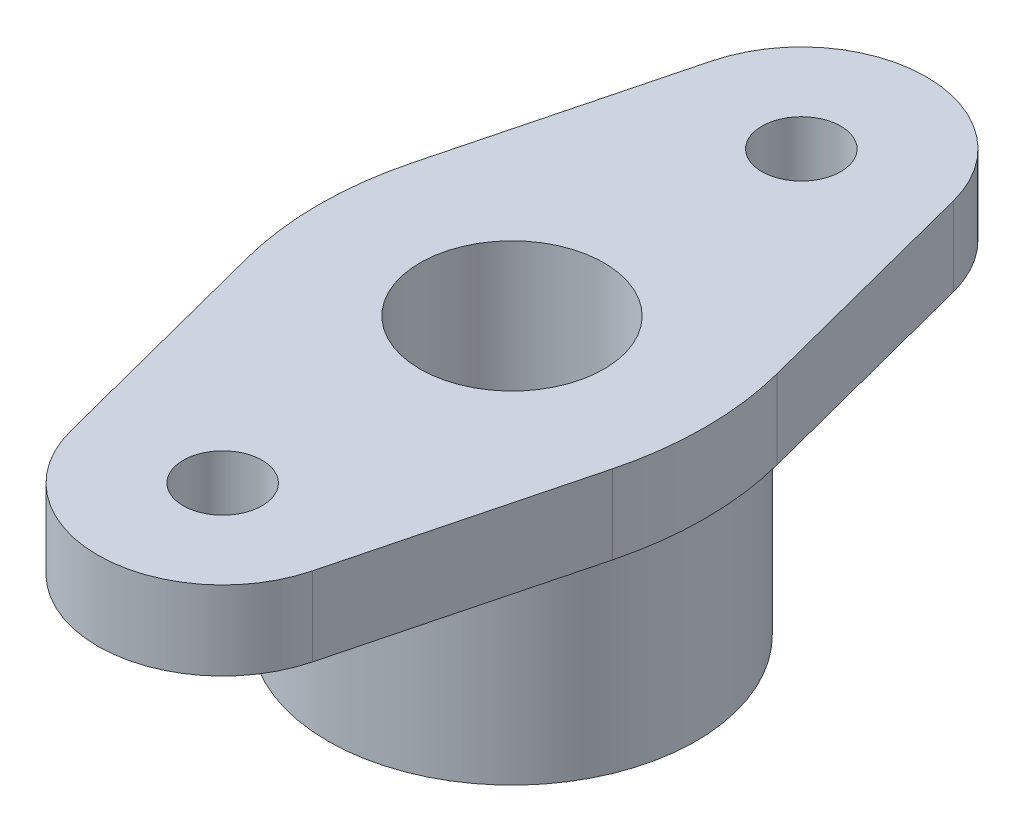
ISO-10303-21;
HEADER;
FILE_DESCRIPTION(('STEP AP214'),'2;1');
FILE_NAME('part.step','',(''),(''),'','','');
FILE_SCHEMA(('AUTOMOTIVE_DESIGN { 1 0 10303 214 1 1 1 1 }'));
ENDSEC;
DATA;
#1=APPLICATION_CONTEXT('core data for automotive mechanical design processes');
#2=APPLICATION_PROTOCOL_DEFINITION('international standard','automotive_design',2000,#1);
#3=PRODUCT_CONTEXT('',#1,'mechanical');
#4=PRODUCT('Part','Part','',(#3));
#5=PRODUCT_RELATED_PRODUCT_CATEGORY('part','',(#4));
#6=PRODUCT_DEFINITION_FORMATION('','',#4);
#7=PRODUCT_DEFINITION_CONTEXT('part definition',#1,'design');
#8=PRODUCT_DEFINITION('design','',#6,#7);
#9=PRODUCT_DEFINITION_SHAPE('','',#8);
#10=(LENGTH_UNIT() NAMED_UNIT(*) SI_UNIT(.MILLI.,.METRE.));
#11=(NAMED_UNIT(*) PLANE_ANGLE_UNIT() SI_UNIT($,.RADIAN.));
#12=(NAMED_UNIT(*) SI_UNIT($,.STERADIAN.) SOLID_ANGLE_UNIT());
#13=UNCERTAINTY_MEASURE_WITH_UNIT(LENGTH_MEASURE(1.E-05),#10,'distance_accuracy_value','');
#14=(GEOMETRIC_REPRESENTATION_CONTEXT(3) GLOBAL_UNCERTAINTY_ASSIGNED_CONTEXT((#13)) GLOBAL_UNIT_ASSIGNED_CONTEXT((#10,
#11,#12)) REPRESENTATION_CONTEXT('',''));
#15=CARTESIAN_POINT('',(0.,0.,0.));
#16=DIRECTION('',(0.,0.,1.));
#17=DIRECTION('',(1.,0.,0.));
#18=AXIS2_PLACEMENT_3D('',#15,#16,#17);
#19=CARTESIAN_POINT('',(0.,12.,44.));
#20=DIRECTION('',(0.,-1.,0.));
#21=DIRECTION('',(0.,0.,-1.));
#22=AXIS2_PLACEMENT_3D('',#19,#20,#21);
#23=CYLINDRICAL_SURFACE('',#22,19.);
#24=CARTESIAN_POINT('',(0.,0.,44.));
#25=DIRECTION('',(0.,1.,0.));
#26=DIRECTION('',(0.,0.,1.));
#27=AXIS2_PLACEMENT_3D('',#24,#25,#26);
#28=CIRCLE('',#27,19.);
#29=CARTESIAN_POINT('',(18.3951965051348,0.,48.7557066286177));
#30=VERTEX_POINT('',#29);
#31=CARTESIAN_POINT('',(-18.3951965051348,0.,48.7557066286177));
#32=VERTEX_POINT('',#31);
#33=EDGE_CURVE('E108',#30,#32,#28,.F.);
#34=ORIENTED_EDGE('',*,*,#33,.F.);
#35=DIRECTION('',(0.,-1.,0.));
#36=VECTOR('',#35,1.);
#37=CARTESIAN_POINT('',(18.3951965051348,12.,48.7557066286177));
#38=LINE('',#37,#36);
#39=CARTESIAN_POINT('',(18.3951965051348,12.,48.7557066286177));
#40=VERTEX_POINT('',#39);
#41=EDGE_CURVE('E103',#40,#30,#38,.T.);
#42=ORIENTED_EDGE('',*,*,#41,.F.);
#43=CARTESIAN_POINT('',(0.,12.,44.));
#44=DIRECTION('',(0.,1.,0.));
#45=DIRECTION('',(0.,0.,1.));
#46=AXIS2_PLACEMENT_3D('',#43,#44,#45);
#47=CIRCLE('',#46,19.);
#48=CARTESIAN_POINT('',(-18.3951965051348,12.,48.7557066286177));
#49=VERTEX_POINT('',#48);
#50=EDGE_CURVE('E105',#40,#49,#47,.F.);
#51=ORIENTED_EDGE('',*,*,#50,.T.);
#52=DIRECTION('',(0.,-1.,0.));
#53=VECTOR('',#52,1.);
#54=CARTESIAN_POINT('',(-18.3951965051348,12.,48.7557066286177));
#55=LINE('',#54,#53);
#56=EDGE_CURVE('E139',#49,#32,#55,.T.);
#57=ORIENTED_EDGE('',*,*,#56,.T.);
#58=EDGE_LOOP('',(#34,#42,#51,#57));
#59=FACE_BOUND('',#58,.T.);
#60=ADVANCED_FACE('F36',(#59),#23,.T.);
#61=CARTESIAN_POINT('',(29.0578417959506,12.,7.51231827307482));
#62=DIRECTION('',(-0.968168237112356,0.,-0.250300348874614));
#63=DIRECTION('',(-0.250300348874614,0.,0.968168237112356));
#64=AXIS2_PLACEMENT_3D('',#61,#62,#63);
#65=PLANE('',#64);
#66=DIRECTION('',(0.250300348874614,0.,-0.968168237112356));
#67=VECTOR('',#66,1.);
#68=CARTESIAN_POINT('',(29.0578417959506,0.,7.51231827307482));
#69=LINE('',#68,#67);
#70=CARTESIAN_POINT('',(27.7644949376973,0.,12.5150174437307));
#71=VERTEX_POINT('',#70);
#72=EDGE_CURVE('E145',#30,#71,#69,.T.);
#73=ORIENTED_EDGE('',*,*,#72,.T.);
#74=DIRECTION('',(0.,-1.,0.));
#75=VECTOR('',#74,1.);
#76=CARTESIAN_POINT('',(27.7644949376973,12.,12.5150174437307));
#77=LINE('',#76,#75);
#78=CARTESIAN_POINT('',(27.7644949376973,12.,12.5150174437307));
#79=VERTEX_POINT('',#78);
#80=EDGE_CURVE('E44',#71,#79,#77,.F.);
#81=ORIENTED_EDGE('',*,*,#80,.T.);
#82=DIRECTION('',(0.250300348874614,0.,-0.968168237112356));
#83=VECTOR('',#82,1.);
#84=CARTESIAN_POINT('',(29.0578417959506,12.,7.51231827307482));
#85=LINE('',#84,#83);
#86=EDGE_CURVE('E113',#40,#79,#85,.T.);
#87=ORIENTED_EDGE('',*,*,#86,.F.);
#88=ORIENTED_EDGE('',*,*,#41,.T.);
#89=EDGE_LOOP('',(#73,#81,#87,#88));
#90=FACE_BOUND('',#89,.T.);
#91=ADVANCED_FACE('F114',(#90),#65,.F.);
#92=CARTESIAN_POINT('',(29.0578417959506,12.,-7.51231827307482));
#93=DIRECTION('',(0.968168237112356,0.,-0.250300348874614));
#94=DIRECTION('',(-0.250300348874614,0.,-0.968168237112356));
#95=AXIS2_PLACEMENT_3D('',#92,#93,#94);
#96=PLANE('',#95);
#97=DIRECTION('',(0.250300348874614,0.,0.968168237112356));
#98=VECTOR('',#97,1.);
#99=CARTESIAN_POINT('',(29.0578417959506,12.,-7.51231827307482));
#100=LINE('',#99,#98);
#101=CARTESIAN_POINT('',(18.3951965051348,12.,-48.7557066286177));
#102=VERTEX_POINT('',#101);
#103=CARTESIAN_POINT('',(27.7644949376973,12.,-12.5150174437307));
#104=VERTEX_POINT('',#103);
#105=EDGE_CURVE('E115',#102,#104,#100,.T.);
#106=ORIENTED_EDGE('',*,*,#105,.T.);
#107=DIRECTION('',(0.,-1.,0.));
#108=VECTOR('',#107,1.);
#109=CARTESIAN_POINT('',(27.7644949376973,0.,-12.5150174437307));
#110=LINE('',#109,#108);
#111=CARTESIAN_POINT('',(27.7644949376973,0.,-12.5150174437307));
#112=VERTEX_POINT('',#111);
#113=EDGE_CURVE('E178',#104,#112,#110,.T.);
#114=ORIENTED_EDGE('',*,*,#113,.T.);
#115=DIRECTION('',(0.250300348874614,0.,0.968168237112356));
#116=VECTOR('',#115,1.);
#117=CARTESIAN_POINT('',(29.0578417959506,0.,-7.51231827307482));
#118=LINE('',#117,#116);
#119=CARTESIAN_POINT('',(18.3951965051348,0.,-48.7557066286177));
#120=VERTEX_POINT('',#119);
#121=EDGE_CURVE('E147',#120,#112,#118,.T.);
#122=ORIENTED_EDGE('',*,*,#121,.F.);
#123=DIRECTION('',(0.,-1.,0.));
#124=VECTOR('',#123,1.);
#125=CARTESIAN_POINT('',(18.3951965051348,12.,-48.7557066286177));
#126=LINE('',#125,#124);
#127=EDGE_CURVE('E111',#102,#120,#126,.T.);
#128=ORIENTED_EDGE('',*,*,#127,.F.);
#129=EDGE_LOOP('',(#106,#114,#122,#128));
#130=FACE_BOUND('',#129,.T.);
#131=ADVANCED_FACE('F183',(#130),#96,.T.);
#132=CARTESIAN_POINT('',(0.,12.,-44.));
#133=DIRECTION('',(0.,-1.,0.));
#134=DIRECTION('',(0.,0.,-1.));
#135=AXIS2_PLACEMENT_3D('',#132,#133,#134);
#136=CYLINDRICAL_SURFACE('',#135,19.);
#137=CARTESIAN_POINT('',(0.,0.,-44.));
#138=DIRECTION('',(0.,1.,0.));
#139=DIRECTION('',(0.,0.,1.));
#140=AXIS2_PLACEMENT_3D('',#137,#138,#139);
#141=CIRCLE('',#140,19.);
#142=CARTESIAN_POINT('',(-18.3951965051348,0.,-48.7557066286177));
#143=VERTEX_POINT('',#142);
#144=EDGE_CURVE('E150',#120,#143,#141,.T.);
#145=ORIENTED_EDGE('',*,*,#144,.T.);
#146=DIRECTION('',(0.,-1.,0.));
#147=VECTOR('',#146,1.);
#148=CARTESIAN_POINT('',(-18.3951965051348,12.,-48.7557066286177));
#149=LINE('',#148,#147);
#150=CARTESIAN_POINT('',(-18.3951965051348,12.,-48.7557066286177));
#151=VERTEX_POINT('',#150);
#152=EDGE_CURVE('E163',#151,#143,#149,.T.);
#153=ORIENTED_EDGE('',*,*,#152,.F.);
#154=CARTESIAN_POINT('',(0.,12.,-44.));
#155=DIRECTION('',(0.,1.,0.));
#156=DIRECTION('',(0.,0.,1.));
#157=AXIS2_PLACEMENT_3D('',#154,#155,#156);
#158=CIRCLE('',#157,19.);
#159=EDGE_CURVE('E130',#102,#151,#158,.T.);
#160=ORIENTED_EDGE('',*,*,#159,.F.);
#161=ORIENTED_EDGE('',*,*,#127,.T.);
#162=EDGE_LOOP('',(#145,#153,#160,#161));
#163=FACE_BOUND('',#162,.T.);
#164=ADVANCED_FACE('F191',(#163),#136,.T.);
#165=CARTESIAN_POINT('',(-29.0578417959506,12.,-7.51231827307482));
#166=DIRECTION('',(0.968168237112356,0.,0.250300348874614));
#167=DIRECTION('',(0.250300348874614,0.,-0.968168237112356));
#168=AXIS2_PLACEMENT_3D('',#165,#166,#167);
#169=PLANE('',#168);
#170=DIRECTION('',(-0.250300348874614,0.,0.968168237112356));
#171=VECTOR('',#170,1.);
#172=CARTESIAN_POINT('',(-29.0578417959506,0.,-7.51231827307482));
#173=LINE('',#172,#171);
#174=CARTESIAN_POINT('',(-27.7644949376973,0.,-12.5150174437307));
#175=VERTEX_POINT('',#174);
#176=EDGE_CURVE('E153',#143,#175,#173,.T.);
#177=ORIENTED_EDGE('',*,*,#176,.T.);
#178=DIRECTION('',(0.,-1.,0.));
#179=VECTOR('',#178,1.);
#180=CARTESIAN_POINT('',(-27.7644949376973,12.,-12.5150174437307));
#181=LINE('',#180,#179);
#182=CARTESIAN_POINT('',(-27.7644949376973,12.,-12.5150174437307));
#183=VERTEX_POINT('',#182);
#184=EDGE_CURVE('E173',#175,#183,#181,.F.);
#185=ORIENTED_EDGE('',*,*,#184,.T.);
#186=DIRECTION('',(-0.250300348874614,0.,0.968168237112356));
#187=VECTOR('',#186,1.);
#188=CARTESIAN_POINT('',(-29.0578417959506,12.,-7.51231827307482));
#189=LINE('',#188,#187);
#190=EDGE_CURVE('E133',#151,#183,#189,.T.);
#191=ORIENTED_EDGE('',*,*,#190,.F.);
#192=ORIENTED_EDGE('',*,*,#152,.T.);
#193=EDGE_LOOP('',(#177,#185,#191,#192));
#194=FACE_BOUND('',#193,.T.);
#195=ADVANCED_FACE('F258',(#194),#169,.F.);
#196=CARTESIAN_POINT('',(-29.0578417959506,12.,7.51231827307483));
#197=DIRECTION('',(-0.968168237112356,0.,0.250300348874614));
#198=DIRECTION('',(0.250300348874614,0.,0.968168237112356));
#199=AXIS2_PLACEMENT_3D('',#196,#197,#198);
#200=PLANE('',#199);
#201=DIRECTION('',(-0.250300348874614,0.,-0.968168237112356));
#202=VECTOR('',#201,1.);
#203=CARTESIAN_POINT('',(-29.0578417959506,12.,7.51231827307483));
#204=LINE('',#203,#202);
#205=CARTESIAN_POINT('',(-27.7644949376973,12.,12.5150174437307));
#206=VERTEX_POINT('',#205);
#207=EDGE_CURVE('E121',#49,#206,#204,.T.);
#208=ORIENTED_EDGE('',*,*,#207,.T.);
#209=DIRECTION('',(0.,-1.,0.));
#210=VECTOR('',#209,1.);
#211=CARTESIAN_POINT('',(-27.7644949376973,0.,12.5150174437307));
#212=LINE('',#211,#210);
#213=CARTESIAN_POINT('',(-27.7644949376973,0.,12.5150174437307));
#214=VERTEX_POINT('',#213);
#215=EDGE_CURVE('E110',#206,#214,#212,.T.);
#216=ORIENTED_EDGE('',*,*,#215,.T.);
#217=DIRECTION('',(-0.250300348874614,0.,-0.968168237112356));
#218=VECTOR('',#217,1.);
#219=CARTESIAN_POINT('',(-29.0578417959506,0.,7.51231827307483));
#220=LINE('',#219,#218);
#221=EDGE_CURVE('E156',#32,#214,#220,.T.);
#222=ORIENTED_EDGE('',*,*,#221,.F.);
#223=ORIENTED_EDGE('',*,*,#56,.F.);
#224=EDGE_LOOP('',(#208,#216,#222,#223));
#225=FACE_BOUND('',#224,.T.);
#226=ADVANCED_FACE('F201',(#225),#200,.T.);
#227=CARTESIAN_POINT('',(0.,12.,-44.));
#228=DIRECTION('',(0.,-1.,0.));
#229=DIRECTION('',(0.,0.,-1.));
#230=AXIS2_PLACEMENT_3D('',#227,#228,#229);
#231=CYLINDRICAL_SURFACE('',#230,6.);
#232=CARTESIAN_POINT('',(0.,12.,-44.));
#233=DIRECTION('',(0.,1.,0.));
#234=DIRECTION('',(0.,0.,1.));
#235=AXIS2_PLACEMENT_3D('',#232,#233,#234);
#236=CIRCLE('',#235,6.);
#237=CARTESIAN_POINT('',(0.,12.,-38.));
#238=VERTEX_POINT('',#237);
#239=EDGE_CURVE('E122',#238,#238,#236,.T.);
#240=ORIENTED_EDGE('',*,*,#239,.T.);
#241=EDGE_LOOP('',(#240));
#242=FACE_BOUND('',#241,.T.);
#243=CARTESIAN_POINT('',(0.,0.,-44.));
#244=DIRECTION('',(0.,1.,0.));
#245=DIRECTION('',(0.,0.,1.));
#246=AXIS2_PLACEMENT_3D('',#243,#244,#245);
#247=CIRCLE('',#246,6.);
#248=CARTESIAN_POINT('',(0.,0.,-38.));
#249=VERTEX_POINT('',#248);
#250=EDGE_CURVE('E140',#249,#249,#247,.T.);
#251=ORIENTED_EDGE('',*,*,#250,.F.);
#252=EDGE_LOOP('',(#251));
#253=FACE_BOUND('',#252,.T.);
#254=ADVANCED_FACE('F219',(#242,#253),#231,.F.);
#255=CARTESIAN_POINT('',(0.,12.,0.));
#256=DIRECTION('',(0.,-1.,0.));
#257=DIRECTION('',(0.,0.,-1.));
#258=AXIS2_PLACEMENT_3D('',#255,#256,#257);
#259=CYLINDRICAL_SURFACE('',#258,14.);
#260=CARTESIAN_POINT('',(0.,12.,0.));
#261=DIRECTION('',(0.,1.,0.));
#262=DIRECTION('',(0.,0.,1.));
#263=AXIS2_PLACEMENT_3D('',#260,#261,#262);
#264=CIRCLE('',#263,14.);
#265=CARTESIAN_POINT('',(0.,12.,14.));
#266=VERTEX_POINT('',#265);
#267=EDGE_CURVE('E125',#266,#266,#264,.T.);
#268=ORIENTED_EDGE('',*,*,#267,.T.);
#269=EDGE_LOOP('',(#268));
#270=FACE_BOUND('',#269,.T.);
#271=CARTESIAN_POINT('',(0.,-21.9170962313451,0.));
#272=DIRECTION('',(0.,1.,0.));
#273=DIRECTION('',(0.,0.,1.));
#274=AXIS2_PLACEMENT_3D('',#271,#272,#273);
#275=CIRCLE('',#274,14.);
#276=CARTESIAN_POINT('',(0.,-21.9170962313451,14.));
#277=VERTEX_POINT('',#276);
#278=EDGE_CURVE('E237',#277,#277,#275,.T.);
#279=ORIENTED_EDGE('',*,*,#278,.F.);
#280=EDGE_LOOP('',(#279));
#281=FACE_BOUND('',#280,.T.);
#282=ADVANCED_FACE('F222',(#270,#281),#259,.F.);
#283=CARTESIAN_POINT('',(0.,12.,44.));
#284=DIRECTION('',(0.,-1.,0.));
#285=DIRECTION('',(0.,0.,-1.));
#286=AXIS2_PLACEMENT_3D('',#283,#284,#285);
#287=CYLINDRICAL_SURFACE('',#286,6.);
#288=CARTESIAN_POINT('',(0.,12.,44.));
#289=DIRECTION('',(0.,1.,0.));
#290=DIRECTION('',(0.,0.,1.));
#291=AXIS2_PLACEMENT_3D('',#288,#289,#290);
#292=CIRCLE('',#291,6.);
#293=CARTESIAN_POINT('',(0.,12.,50.));
#294=VERTEX_POINT('',#293);
#295=EDGE_CURVE('E136',#294,#294,#292,.F.);
#296=ORIENTED_EDGE('',*,*,#295,.F.);
#297=EDGE_LOOP('',(#296));
#298=FACE_BOUND('',#297,.T.);
#299=CARTESIAN_POINT('',(0.,0.,44.));
#300=DIRECTION('',(0.,1.,0.));
#301=DIRECTION('',(0.,0.,1.));
#302=AXIS2_PLACEMENT_3D('',#299,#300,#301);
#303=CIRCLE('',#302,6.);
#304=CARTESIAN_POINT('',(0.,0.,50.));
#305=VERTEX_POINT('',#304);
#306=EDGE_CURVE('E159',#305,#305,#303,.F.);
#307=ORIENTED_EDGE('',*,*,#306,.T.);
#308=EDGE_LOOP('',(#307));
#309=FACE_BOUND('',#308,.T.);
#310=ADVANCED_FACE('F225',(#298,#309),#287,.F.);
#311=CARTESIAN_POINT('',(0.,12.,0.));
#312=DIRECTION('',(0.,1.,0.));
#313=DIRECTION('',(0.,0.,1.));
#314=AXIS2_PLACEMENT_3D('',#311,#312,#313);
#315=PLANE('',#314);
#316=ORIENTED_EDGE('',*,*,#267,.F.);
#317=EDGE_LOOP('',(#316));
#318=FACE_BOUND('',#317,.T.);
#319=ORIENTED_EDGE('',*,*,#239,.F.);
#320=EDGE_LOOP('',(#319));
#321=FACE_BOUND('',#320,.T.);
#322=ORIENTED_EDGE('',*,*,#190,.T.);
#323=CARTESIAN_POINT('',(20.6439169179205,12.,0.));
#324=DIRECTION('',(0.,1.,0.));
#325=DIRECTION('',(0.,0.,1.));
#326=AXIS2_PLACEMENT_3D('',#323,#324,#325);
#327=CIRCLE('',#326,50.);
#328=EDGE_CURVE('E176',#183,#206,#327,.T.);
#329=ORIENTED_EDGE('',*,*,#328,.T.);
#330=ORIENTED_EDGE('',*,*,#207,.F.);
#331=ORIENTED_EDGE('',*,*,#50,.F.);
#332=ORIENTED_EDGE('',*,*,#86,.T.);
#333=CARTESIAN_POINT('',(-20.6439169179205,12.,0.));
#334=DIRECTION('',(0.,1.,0.));
#335=DIRECTION('',(0.,0.,1.));
#336=AXIS2_PLACEMENT_3D('',#333,#334,#335);
#337=CIRCLE('',#336,50.);
#338=EDGE_CURVE('E51',#79,#104,#337,.T.);
#339=ORIENTED_EDGE('',*,*,#338,.T.);
#340=ORIENTED_EDGE('',*,*,#105,.F.);
#341=ORIENTED_EDGE('',*,*,#159,.T.);
#342=EDGE_LOOP('',(#322,#329,#330,#331,#332,#339,#340,#341));
#343=FACE_BOUND('',#342,.T.);
#344=ORIENTED_EDGE('',*,*,#295,.T.);
#345=EDGE_LOOP('',(#344));
#346=FACE_BOUND('',#345,.T.);
#347=ADVANCED_FACE('F118',(#318,#321,#343,#346),#315,.T.);
#348=CARTESIAN_POINT('',(0.,0.,0.));
#349=DIRECTION('',(0.,1.,0.));
#350=DIRECTION('',(0.,0.,1.));
#351=AXIS2_PLACEMENT_3D('',#348,#349,#350);
#352=PLANE('',#351);
#353=CARTESIAN_POINT('',(0.,0.,0.));
#354=DIRECTION('',(0.,1.,0.));
#355=DIRECTION('',(0.,0.,1.));
#356=AXIS2_PLACEMENT_3D('',#353,#354,#355);
#357=CIRCLE('',#356,28.);
#358=CARTESIAN_POINT('',(0.,0.,28.));
#359=VERTEX_POINT('',#358);
#360=EDGE_CURVE('E11',#359,#359,#357,.F.);
#361=ORIENTED_EDGE('',*,*,#360,.F.);
#362=EDGE_LOOP('',(#361));
#363=FACE_BOUND('',#362,.T.);
#364=ORIENTED_EDGE('',*,*,#250,.T.);
#365=EDGE_LOOP('',(#364));
#366=FACE_BOUND('',#365,.T.);
#367=ORIENTED_EDGE('',*,*,#221,.T.);
#368=CARTESIAN_POINT('',(20.6439169179205,0.,0.));
#369=DIRECTION('',(0.,1.,0.));
#370=DIRECTION('',(0.,0.,1.));
#371=AXIS2_PLACEMENT_3D('',#368,#369,#370);
#372=CIRCLE('',#371,50.);
#373=EDGE_CURVE('E171',#214,#175,#372,.F.);
#374=ORIENTED_EDGE('',*,*,#373,.T.);
#375=ORIENTED_EDGE('',*,*,#176,.F.);
#376=ORIENTED_EDGE('',*,*,#144,.F.);
#377=ORIENTED_EDGE('',*,*,#121,.T.);
#378=CARTESIAN_POINT('',(-20.6439169179205,0.,0.));
#379=DIRECTION('',(0.,1.,0.));
#380=DIRECTION('',(0.,0.,1.));
#381=AXIS2_PLACEMENT_3D('',#378,#379,#380);
#382=CIRCLE('',#381,50.);
#383=EDGE_CURVE('E169',#112,#71,#382,.F.);
#384=ORIENTED_EDGE('',*,*,#383,.T.);
#385=ORIENTED_EDGE('',*,*,#72,.F.);
#386=ORIENTED_EDGE('',*,*,#33,.T.);
#387=EDGE_LOOP('',(#367,#374,#375,#376,#377,#384,#385,#386));
#388=FACE_BOUND('',#387,.T.);
#389=ORIENTED_EDGE('',*,*,#306,.F.);
#390=EDGE_LOOP('',(#389));
#391=FACE_BOUND('',#390,.T.);
#392=ADVANCED_FACE('F187',(#363,#366,#388,#391),#352,.F.);
#393=CARTESIAN_POINT('',(20.6439169179205,12.,0.));
#394=DIRECTION('',(0.,1.,0.));
#395=DIRECTION('',(0.,0.,1.));
#396=AXIS2_PLACEMENT_3D('',#393,#394,#395);
#397=CYLINDRICAL_SURFACE('',#396,50.);
#398=ORIENTED_EDGE('',*,*,#328,.F.);
#399=ORIENTED_EDGE('',*,*,#184,.F.);
#400=ORIENTED_EDGE('',*,*,#373,.F.);
#401=ORIENTED_EDGE('',*,*,#215,.F.);
#402=EDGE_LOOP('',(#398,#399,#400,#401));
#403=FACE_BOUND('',#402,.T.);
#404=ADVANCED_FACE('F198',(#403),#397,.T.);
#405=CARTESIAN_POINT('',(-20.6439169179205,12.,0.));
#406=DIRECTION('',(0.,1.,0.));
#407=DIRECTION('',(0.,0.,1.));
#408=AXIS2_PLACEMENT_3D('',#405,#406,#407);
#409=CYLINDRICAL_SURFACE('',#408,50.);
#410=ORIENTED_EDGE('',*,*,#338,.F.);
#411=ORIENTED_EDGE('',*,*,#80,.F.);
#412=ORIENTED_EDGE('',*,*,#383,.F.);
#413=ORIENTED_EDGE('',*,*,#113,.F.);
#414=EDGE_LOOP('',(#410,#411,#412,#413));
#415=FACE_BOUND('',#414,.T.);
#416=ADVANCED_FACE('F38',(#415),#409,.T.);
#417=CARTESIAN_POINT('',(0.,25.4525410315043,0.));
#418=DIRECTION('',(0.,1.,0.));
#419=DIRECTION('',(0.,0.,1.));
#420=AXIS2_PLACEMENT_3D('',#417,#418,#419);
#421=CYLINDRICAL_SURFACE('',#420,28.);
#422=ORIENTED_EDGE('',*,*,#360,.T.);
#423=EDGE_LOOP('',(#422));
#424=FACE_BOUND('',#423,.T.);
#425=CARTESIAN_POINT('',(0.,-30.,0.));
#426=DIRECTION('',(0.,1.,0.));
#427=DIRECTION('',(0.,0.,1.));
#428=AXIS2_PLACEMENT_3D('',#425,#426,#427);
#429=CIRCLE('',#428,28.);
#430=CARTESIAN_POINT('',(0.,-30.,28.));
#431=VERTEX_POINT('',#430);
#432=EDGE_CURVE('E143',#431,#431,#429,.T.);
#433=ORIENTED_EDGE('',*,*,#432,.T.);
#434=EDGE_LOOP('',(#433));
#435=FACE_BOUND('',#434,.T.);
#436=ADVANCED_FACE('F203',(#424,#435),#421,.T.);
#437=CARTESIAN_POINT('',(0.,-21.9170962313451,0.));
#438=DIRECTION('',(0.,-1.,0.));
#439=DIRECTION('',(0.,0.,-1.));
#440=AXIS2_PLACEMENT_3D('',#437,#438,#439);
#441=CONICAL_SURFACE('',#440,14.,1.04719755119659);
#442=ORIENTED_EDGE('',*,*,#432,.F.);
#443=EDGE_LOOP('',(#442));
#444=FACE_BOUND('',#443,.T.);
#445=ORIENTED_EDGE('',*,*,#278,.T.);
#446=EDGE_LOOP('',(#445));
#447=FACE_BOUND('',#446,.T.);
#448=ADVANCED_FACE('F208',(#444,#447),#441,.F.);
#449=CLOSED_SHELL('',(#60,#91,#131,#164,#195,#226,#254,#282,#310,#347,#392,#404,#416,#436,#448));
#450=MANIFOLD_SOLID_BREP('B2',#449);
#451=ADVANCED_BREP_SHAPE_REPRESENTATION('',(#18,#450),#14);
#452=SHAPE_DEFINITION_REPRESENTATION(#9,#451);
ENDSEC;
END-ISO-10303-21;
